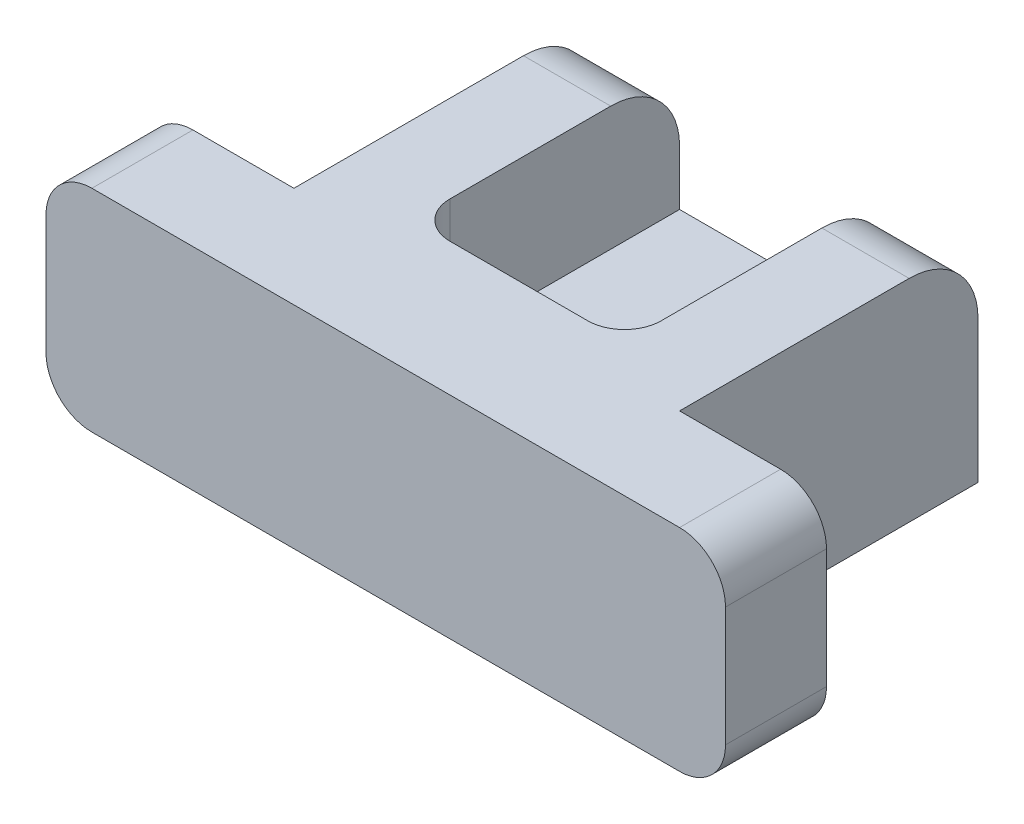
ISO-10303-21;
HEADER;
FILE_DESCRIPTION(('STEP AP214'),'2;1');
FILE_NAME('part.step','',(''),(''),'','','');
FILE_SCHEMA(('AUTOMOTIVE_DESIGN { 1 0 10303 214 1 1 1 1 }'));
ENDSEC;
DATA;
#1=APPLICATION_CONTEXT('core data for automotive mechanical design processes');
#2=APPLICATION_PROTOCOL_DEFINITION('international standard','automotive_design',2000,#1);
#3=PRODUCT_CONTEXT('',#1,'mechanical');
#4=PRODUCT('Part','Part','',(#3));
#5=PRODUCT_RELATED_PRODUCT_CATEGORY('part','',(#4));
#6=PRODUCT_DEFINITION_FORMATION('','',#4);
#7=PRODUCT_DEFINITION_CONTEXT('part definition',#1,'design');
#8=PRODUCT_DEFINITION('design','',#6,#7);
#9=PRODUCT_DEFINITION_SHAPE('','',#8);
#10=(LENGTH_UNIT() NAMED_UNIT(*) SI_UNIT(.MILLI.,.METRE.));
#11=(NAMED_UNIT(*) PLANE_ANGLE_UNIT() SI_UNIT($,.RADIAN.));
#12=(NAMED_UNIT(*) SI_UNIT($,.STERADIAN.) SOLID_ANGLE_UNIT());
#13=UNCERTAINTY_MEASURE_WITH_UNIT(LENGTH_MEASURE(1.E-05),#10,'distance_accuracy_value','');
#14=(GEOMETRIC_REPRESENTATION_CONTEXT(3) GLOBAL_UNCERTAINTY_ASSIGNED_CONTEXT((#13)) GLOBAL_UNIT_ASSIGNED_CONTEXT((#10,
#11,#12)) REPRESENTATION_CONTEXT('',''));
#15=CARTESIAN_POINT('',(0.,0.,0.));
#16=DIRECTION('',(0.,0.,1.));
#17=DIRECTION('',(1.,0.,0.));
#18=AXIS2_PLACEMENT_3D('',#15,#16,#17);
#19=CARTESIAN_POINT('',(640.,360.,0.));
#20=DIRECTION('',(0.,0.,1.));
#21=DIRECTION('',(1.,0.,0.));
#22=AXIS2_PLACEMENT_3D('',#19,#20,#21);
#23=PLANE('',#22);
#24=DIRECTION('',(0.,1.,0.));
#25=VECTOR('',#24,1.);
#26=CARTESIAN_POINT('',(-420.,0.,0.));
#27=LINE('',#26,#25);
#28=CARTESIAN_POINT('',(-420.,0.,0.));
#29=VERTEX_POINT('',#28);
#30=CARTESIAN_POINT('',(-420.,460.,0.));
#31=VERTEX_POINT('',#30);
#32=EDGE_CURVE('E278',#29,#31,#27,.T.);
#33=ORIENTED_EDGE('',*,*,#32,.F.);
#34=DIRECTION('',(1.,0.,0.));
#35=VECTOR('',#34,1.);
#36=CARTESIAN_POINT('',(639.999999999999,0.,0.));
#37=LINE('',#36,#35);
#38=CARTESIAN_POINT('',(-639.999999999999,0.,0.));
#39=VERTEX_POINT('',#38);
#40=EDGE_CURVE('E333',#39,#29,#37,.T.);
#41=ORIENTED_EDGE('',*,*,#40,.F.);
#42=CARTESIAN_POINT('',(-640.,100.,0.));
#43=DIRECTION('',(0.,0.,1.));
#44=DIRECTION('',(1.,0.,0.));
#45=AXIS2_PLACEMENT_3D('',#42,#43,#44);
#46=CIRCLE('',#45,100.);
#47=CARTESIAN_POINT('',(-740.,100.000000000001,0.));
#48=VERTEX_POINT('',#47);
#49=EDGE_CURVE('E329',#48,#39,#46,.T.);
#50=ORIENTED_EDGE('',*,*,#49,.F.);
#51=DIRECTION('',(0.,-1.,0.));
#52=VECTOR('',#51,1.);
#53=CARTESIAN_POINT('',(-740.,359.999999999999,0.));
#54=LINE('',#53,#52);
#55=CARTESIAN_POINT('',(-740.,359.999999999999,0.));
#56=VERTEX_POINT('',#55);
#57=EDGE_CURVE('E326',#56,#48,#54,.T.);
#58=ORIENTED_EDGE('',*,*,#57,.F.);
#59=CARTESIAN_POINT('',(-640.,360.,0.));
#60=DIRECTION('',(0.,0.,1.));
#61=DIRECTION('',(-1.,0.,0.));
#62=AXIS2_PLACEMENT_3D('',#59,#60,#61);
#63=CIRCLE('',#62,100.);
#64=CARTESIAN_POINT('',(-639.999999999999,460.,0.));
#65=VERTEX_POINT('',#64);
#66=EDGE_CURVE('E323',#65,#56,#63,.T.);
#67=ORIENTED_EDGE('',*,*,#66,.F.);
#68=DIRECTION('',(-1.,0.,0.));
#69=VECTOR('',#68,1.);
#70=CARTESIAN_POINT('',(-639.999999999999,460.,0.));
#71=LINE('',#70,#69);
#72=EDGE_CURVE('E318',#31,#65,#71,.T.);
#73=ORIENTED_EDGE('',*,*,#72,.F.);
#74=EDGE_LOOP('',(#33,#41,#50,#58,#67,#73));
#75=FACE_BOUND('',#74,.T.);
#76=ADVANCED_FACE('F45',(#75),#23,.F.);
#77=CARTESIAN_POINT('',(640.,360.,220.));
#78=DIRECTION('',(0.,0.,-1.));
#79=DIRECTION('',(-1.,0.,0.));
#80=AXIS2_PLACEMENT_3D('',#77,#78,#79);
#81=CYLINDRICAL_SURFACE('',#80,100.);
#82=CARTESIAN_POINT('',(640.,360.,0.));
#83=DIRECTION('',(0.,0.,1.));
#84=DIRECTION('',(1.,0.,0.));
#85=AXIS2_PLACEMENT_3D('',#82,#83,#84);
#86=CIRCLE('',#85,100.);
#87=CARTESIAN_POINT('',(740.,359.999999999999,0.));
#88=VERTEX_POINT('',#87);
#89=CARTESIAN_POINT('',(639.999999999999,460.,0.));
#90=VERTEX_POINT('',#89);
#91=EDGE_CURVE('E277',#88,#90,#86,.T.);
#92=ORIENTED_EDGE('',*,*,#91,.T.);
#93=DIRECTION('',(0.,0.,-1.));
#94=VECTOR('',#93,1.);
#95=CARTESIAN_POINT('',(639.999999999999,460.,220.));
#96=LINE('',#95,#94);
#97=CARTESIAN_POINT('',(639.999999999999,460.,220.));
#98=VERTEX_POINT('',#97);
#99=EDGE_CURVE('E369',#98,#90,#96,.T.);
#100=ORIENTED_EDGE('',*,*,#99,.F.);
#101=CARTESIAN_POINT('',(640.,360.,220.));
#102=DIRECTION('',(0.,0.,1.));
#103=DIRECTION('',(1.,0.,0.));
#104=AXIS2_PLACEMENT_3D('',#101,#102,#103);
#105=CIRCLE('',#104,100.);
#106=CARTESIAN_POINT('',(740.,359.999999999999,220.));
#107=VERTEX_POINT('',#106);
#108=EDGE_CURVE('E288',#107,#98,#105,.T.);
#109=ORIENTED_EDGE('',*,*,#108,.F.);
#110=DIRECTION('',(0.,0.,-1.));
#111=VECTOR('',#110,1.);
#112=CARTESIAN_POINT('',(740.,359.999999999999,220.));
#113=LINE('',#112,#111);
#114=EDGE_CURVE('E314',#107,#88,#113,.T.);
#115=ORIENTED_EDGE('',*,*,#114,.T.);
#116=EDGE_LOOP('',(#92,#100,#109,#115));
#117=FACE_BOUND('',#116,.T.);
#118=ADVANCED_FACE('F425',(#117),#81,.T.);
#119=CARTESIAN_POINT('',(-639.999999999999,460.,220.));
#120=DIRECTION('',(0.,-1.,0.));
#121=DIRECTION('',(0.,0.,-1.));
#122=AXIS2_PLACEMENT_3D('',#119,#120,#121);
#123=PLANE('',#122);
#124=DIRECTION('',(0.,0.,-1.));
#125=VECTOR('',#124,1.);
#126=CARTESIAN_POINT('',(420.,460.,-650.));
#127=LINE('',#126,#125);
#128=CARTESIAN_POINT('',(420.,460.,0.));
#129=VERTEX_POINT('',#128);
#130=CARTESIAN_POINT('',(420.,460.,-500.));
#131=VERTEX_POINT('',#130);
#132=EDGE_CURVE('E241',#129,#131,#127,.T.);
#133=ORIENTED_EDGE('',*,*,#132,.T.);
#134=DIRECTION('',(-1.,0.,0.));
#135=VECTOR('',#134,1.);
#136=CARTESIAN_POINT('',(230.,460.,-500.));
#137=LINE('',#136,#135);
#138=CARTESIAN_POINT('',(230.,460.,-500.));
#139=VERTEX_POINT('',#138);
#140=EDGE_CURVE('E386',#131,#139,#137,.T.);
#141=ORIENTED_EDGE('',*,*,#140,.T.);
#142=DIRECTION('',(0.,0.,1.));
#143=VECTOR('',#142,1.);
#144=CARTESIAN_POINT('',(230.,460.,0.));
#145=LINE('',#144,#143);
#146=CARTESIAN_POINT('',(230.,460.,-150.000000000001));
#147=VERTEX_POINT('',#146);
#148=EDGE_CURVE('E229',#139,#147,#145,.T.);
#149=ORIENTED_EDGE('',*,*,#148,.T.);
#150=CARTESIAN_POINT('',(150.,460.,-150.));
#151=DIRECTION('',(0.,1.,0.));
#152=DIRECTION('',(0.,0.,1.));
#153=AXIS2_PLACEMENT_3D('',#150,#151,#152);
#154=CIRCLE('',#153,80.);
#155=CARTESIAN_POINT('',(149.999999999999,460.,-70.));
#156=VERTEX_POINT('',#155);
#157=EDGE_CURVE('E226',#156,#147,#154,.T.);
#158=ORIENTED_EDGE('',*,*,#157,.F.);
#159=DIRECTION('',(-1.,0.,0.));
#160=VECTOR('',#159,1.);
#161=CARTESIAN_POINT('',(0.,460.,-70.));
#162=LINE('',#161,#160);
#163=CARTESIAN_POINT('',(-149.999999999999,460.,-70.));
#164=VERTEX_POINT('',#163);
#165=EDGE_CURVE('E189',#156,#164,#162,.T.);
#166=ORIENTED_EDGE('',*,*,#165,.T.);
#167=CARTESIAN_POINT('',(-150.,460.,-150.));
#168=DIRECTION('',(0.,1.,0.));
#169=DIRECTION('',(0.,0.,1.));
#170=AXIS2_PLACEMENT_3D('',#167,#168,#169);
#171=CIRCLE('',#170,80.);
#172=CARTESIAN_POINT('',(-230.,460.,-150.000000000001));
#173=VERTEX_POINT('',#172);
#174=EDGE_CURVE('E204',#164,#173,#171,.F.);
#175=ORIENTED_EDGE('',*,*,#174,.T.);
#176=DIRECTION('',(0.,0.,1.));
#177=VECTOR('',#176,1.);
#178=CARTESIAN_POINT('',(-230.,460.,0.));
#179=LINE('',#178,#177);
#180=CARTESIAN_POINT('',(-230.,460.,-500.));
#181=VERTEX_POINT('',#180);
#182=EDGE_CURVE('E232',#181,#173,#179,.T.);
#183=ORIENTED_EDGE('',*,*,#182,.F.);
#184=DIRECTION('',(-1.,0.,0.));
#185=VECTOR('',#184,1.);
#186=CARTESIAN_POINT('',(-420.,460.,-500.));
#187=LINE('',#186,#185);
#188=CARTESIAN_POINT('',(-420.,460.,-500.));
#189=VERTEX_POINT('',#188);
#190=EDGE_CURVE('E373',#181,#189,#187,.T.);
#191=ORIENTED_EDGE('',*,*,#190,.T.);
#192=DIRECTION('',(0.,0.,1.));
#193=VECTOR('',#192,1.);
#194=CARTESIAN_POINT('',(-420.,460.,-650.));
#195=LINE('',#194,#193);
#196=EDGE_CURVE('E260',#189,#31,#195,.T.);
#197=ORIENTED_EDGE('',*,*,#196,.T.);
#198=ORIENTED_EDGE('',*,*,#72,.T.);
#199=DIRECTION('',(0.,0.,-1.));
#200=VECTOR('',#199,1.);
#201=CARTESIAN_POINT('',(-639.999999999999,460.,220.));
#202=LINE('',#201,#200);
#203=CARTESIAN_POINT('',(-639.999999999999,460.,220.));
#204=VERTEX_POINT('',#203);
#205=EDGE_CURVE('E365',#204,#65,#202,.T.);
#206=ORIENTED_EDGE('',*,*,#205,.F.);
#207=DIRECTION('',(-1.,0.,0.));
#208=VECTOR('',#207,1.);
#209=CARTESIAN_POINT('',(-639.999999999999,460.,220.));
#210=LINE('',#209,#208);
#211=EDGE_CURVE('E292',#98,#204,#210,.T.);
#212=ORIENTED_EDGE('',*,*,#211,.F.);
#213=ORIENTED_EDGE('',*,*,#99,.T.);
#214=EDGE_CURVE('E319',#90,#129,#71,.T.);
#215=ORIENTED_EDGE('',*,*,#214,.T.);
#216=EDGE_LOOP('',(#133,#141,#149,#158,#166,#175,#183,#191,#197,#198,#206,#212,#213,#215));
#217=FACE_BOUND('',#216,.T.);
#218=ADVANCED_FACE('F397',(#217),#123,.F.);
#219=CARTESIAN_POINT('',(-640.,360.,220.));
#220=DIRECTION('',(0.,0.,-1.));
#221=DIRECTION('',(-1.,0.,0.));
#222=AXIS2_PLACEMENT_3D('',#219,#220,#221);
#223=CYLINDRICAL_SURFACE('',#222,100.);
#224=ORIENTED_EDGE('',*,*,#66,.T.);
#225=DIRECTION('',(0.,0.,-1.));
#226=VECTOR('',#225,1.);
#227=CARTESIAN_POINT('',(-740.,359.999999999999,220.));
#228=LINE('',#227,#226);
#229=CARTESIAN_POINT('',(-740.,359.999999999999,220.));
#230=VERTEX_POINT('',#229);
#231=EDGE_CURVE('E361',#230,#56,#228,.T.);
#232=ORIENTED_EDGE('',*,*,#231,.F.);
#233=CARTESIAN_POINT('',(-640.,360.,220.));
#234=DIRECTION('',(0.,0.,1.));
#235=DIRECTION('',(-1.,0.,0.));
#236=AXIS2_PLACEMENT_3D('',#233,#234,#235);
#237=CIRCLE('',#236,100.);
#238=EDGE_CURVE('E296',#204,#230,#237,.T.);
#239=ORIENTED_EDGE('',*,*,#238,.F.);
#240=ORIENTED_EDGE('',*,*,#205,.T.);
#241=EDGE_LOOP('',(#224,#232,#239,#240));
#242=FACE_BOUND('',#241,.T.);
#243=ADVANCED_FACE('F404',(#242),#223,.T.);
#244=CARTESIAN_POINT('',(-740.,359.999999999999,220.));
#245=DIRECTION('',(1.,0.,0.));
#246=DIRECTION('',(0.,1.,0.));
#247=AXIS2_PLACEMENT_3D('',#244,#245,#246);
#248=PLANE('',#247);
#249=ORIENTED_EDGE('',*,*,#57,.T.);
#250=DIRECTION('',(0.,0.,-1.));
#251=VECTOR('',#250,1.);
#252=CARTESIAN_POINT('',(-740.,100.000000000001,220.));
#253=LINE('',#252,#251);
#254=CARTESIAN_POINT('',(-740.,100.000000000001,220.));
#255=VERTEX_POINT('',#254);
#256=EDGE_CURVE('E357',#255,#48,#253,.T.);
#257=ORIENTED_EDGE('',*,*,#256,.F.);
#258=DIRECTION('',(0.,-1.,0.));
#259=VECTOR('',#258,1.);
#260=CARTESIAN_POINT('',(-740.,359.999999999999,220.));
#261=LINE('',#260,#259);
#262=EDGE_CURVE('E299',#230,#255,#261,.T.);
#263=ORIENTED_EDGE('',*,*,#262,.F.);
#264=ORIENTED_EDGE('',*,*,#231,.T.);
#265=EDGE_LOOP('',(#249,#257,#263,#264));
#266=FACE_BOUND('',#265,.T.);
#267=ADVANCED_FACE('F411',(#266),#248,.F.);
#268=CARTESIAN_POINT('',(-640.,100.,220.));
#269=DIRECTION('',(0.,0.,-1.));
#270=DIRECTION('',(-1.,0.,0.));
#271=AXIS2_PLACEMENT_3D('',#268,#269,#270);
#272=CYLINDRICAL_SURFACE('',#271,100.);
#273=ORIENTED_EDGE('',*,*,#49,.T.);
#274=DIRECTION('',(0.,0.,-1.));
#275=VECTOR('',#274,1.);
#276=CARTESIAN_POINT('',(-639.999999999999,0.,220.));
#277=LINE('',#276,#275);
#278=CARTESIAN_POINT('',(-639.999999999999,0.,220.));
#279=VERTEX_POINT('',#278);
#280=EDGE_CURVE('E353',#279,#39,#277,.T.);
#281=ORIENTED_EDGE('',*,*,#280,.F.);
#282=CARTESIAN_POINT('',(-640.,100.,220.));
#283=DIRECTION('',(0.,0.,1.));
#284=DIRECTION('',(1.,0.,0.));
#285=AXIS2_PLACEMENT_3D('',#282,#283,#284);
#286=CIRCLE('',#285,100.);
#287=EDGE_CURVE('E302',#255,#279,#286,.T.);
#288=ORIENTED_EDGE('',*,*,#287,.F.);
#289=ORIENTED_EDGE('',*,*,#256,.T.);
#290=EDGE_LOOP('',(#273,#281,#288,#289));
#291=FACE_BOUND('',#290,.T.);
#292=ADVANCED_FACE('F415',(#291),#272,.T.);
#293=CARTESIAN_POINT('',(639.999999999999,0.,220.));
#294=DIRECTION('',(0.,1.,0.));
#295=DIRECTION('',(0.,0.,1.));
#296=AXIS2_PLACEMENT_3D('',#293,#294,#295);
#297=PLANE('',#296);
#298=ORIENTED_EDGE('',*,*,#40,.T.);
#299=DIRECTION('',(0.,0.,1.));
#300=VECTOR('',#299,1.);
#301=CARTESIAN_POINT('',(-420.,0.,-650.));
#302=LINE('',#301,#300);
#303=CARTESIAN_POINT('',(-420.,0.,-650.));
#304=VERTEX_POINT('',#303);
#305=EDGE_CURVE('E264',#304,#29,#302,.T.);
#306=ORIENTED_EDGE('',*,*,#305,.F.);
#307=DIRECTION('',(-1.,0.,0.));
#308=VECTOR('',#307,1.);
#309=CARTESIAN_POINT('',(-420.,0.,-650.));
#310=LINE('',#309,#308);
#311=CARTESIAN_POINT('',(420.,0.,-650.));
#312=VERTEX_POINT('',#311);
#313=EDGE_CURVE('E259',#312,#304,#310,.T.);
#314=ORIENTED_EDGE('',*,*,#313,.F.);
#315=DIRECTION('',(0.,0.,-1.));
#316=VECTOR('',#315,1.);
#317=CARTESIAN_POINT('',(420.,0.,-650.));
#318=LINE('',#317,#316);
#319=CARTESIAN_POINT('',(420.,0.,0.));
#320=VERTEX_POINT('',#319);
#321=EDGE_CURVE('E255',#320,#312,#318,.T.);
#322=ORIENTED_EDGE('',*,*,#321,.F.);
#323=CARTESIAN_POINT('',(639.999999999999,0.,0.));
#324=VERTEX_POINT('',#323);
#325=EDGE_CURVE('E332',#320,#324,#37,.T.);
#326=ORIENTED_EDGE('',*,*,#325,.T.);
#327=DIRECTION('',(0.,0.,-1.));
#328=VECTOR('',#327,1.);
#329=CARTESIAN_POINT('',(639.999999999999,0.,220.));
#330=LINE('',#329,#328);
#331=CARTESIAN_POINT('',(639.999999999999,0.,220.));
#332=VERTEX_POINT('',#331);
#333=EDGE_CURVE('E349',#332,#324,#330,.T.);
#334=ORIENTED_EDGE('',*,*,#333,.F.);
#335=DIRECTION('',(1.,0.,0.));
#336=VECTOR('',#335,1.);
#337=CARTESIAN_POINT('',(639.999999999999,0.,220.));
#338=LINE('',#337,#336);
#339=EDGE_CURVE('E305',#279,#332,#338,.T.);
#340=ORIENTED_EDGE('',*,*,#339,.F.);
#341=ORIENTED_EDGE('',*,*,#280,.T.);
#342=EDGE_LOOP('',(#298,#306,#314,#322,#326,#334,#340,#341));
#343=FACE_BOUND('',#342,.T.);
#344=ADVANCED_FACE('F437',(#343),#297,.F.);
#345=CARTESIAN_POINT('',(640.,100.,220.));
#346=DIRECTION('',(0.,0.,-1.));
#347=DIRECTION('',(-1.,0.,0.));
#348=AXIS2_PLACEMENT_3D('',#345,#346,#347);
#349=CYLINDRICAL_SURFACE('',#348,100.);
#350=CARTESIAN_POINT('',(640.,100.,0.));
#351=DIRECTION('',(0.,0.,1.));
#352=DIRECTION('',(-1.,0.,0.));
#353=AXIS2_PLACEMENT_3D('',#350,#351,#352);
#354=CIRCLE('',#353,100.);
#355=CARTESIAN_POINT('',(740.,100.000000000001,0.));
#356=VERTEX_POINT('',#355);
#357=EDGE_CURVE('E337',#324,#356,#354,.T.);
#358=ORIENTED_EDGE('',*,*,#357,.T.);
#359=DIRECTION('',(0.,0.,-1.));
#360=VECTOR('',#359,1.);
#361=CARTESIAN_POINT('',(740.,100.000000000001,220.));
#362=LINE('',#361,#360);
#363=CARTESIAN_POINT('',(740.,100.000000000001,220.));
#364=VERTEX_POINT('',#363);
#365=EDGE_CURVE('E345',#364,#356,#362,.T.);
#366=ORIENTED_EDGE('',*,*,#365,.F.);
#367=CARTESIAN_POINT('',(640.,100.,220.));
#368=DIRECTION('',(0.,0.,1.));
#369=DIRECTION('',(-1.,0.,0.));
#370=AXIS2_PLACEMENT_3D('',#367,#368,#369);
#371=CIRCLE('',#370,100.);
#372=EDGE_CURVE('E308',#332,#364,#371,.T.);
#373=ORIENTED_EDGE('',*,*,#372,.F.);
#374=ORIENTED_EDGE('',*,*,#333,.T.);
#375=EDGE_LOOP('',(#358,#366,#373,#374));
#376=FACE_BOUND('',#375,.T.);
#377=ADVANCED_FACE('F462',(#376),#349,.T.);
#378=CARTESIAN_POINT('',(740.,359.999999999999,220.));
#379=DIRECTION('',(-1.,0.,0.));
#380=DIRECTION('',(0.,-1.,0.));
#381=AXIS2_PLACEMENT_3D('',#378,#379,#380);
#382=PLANE('',#381);
#383=DIRECTION('',(0.,1.,0.));
#384=VECTOR('',#383,1.);
#385=CARTESIAN_POINT('',(740.,359.999999999999,0.));
#386=LINE('',#385,#384);
#387=EDGE_CURVE('E293',#356,#88,#386,.T.);
#388=ORIENTED_EDGE('',*,*,#387,.T.);
#389=ORIENTED_EDGE('',*,*,#114,.F.);
#390=DIRECTION('',(0.,1.,0.));
#391=VECTOR('',#390,1.);
#392=CARTESIAN_POINT('',(740.,359.999999999999,220.));
#393=LINE('',#392,#391);
#394=EDGE_CURVE('E311',#364,#107,#393,.T.);
#395=ORIENTED_EDGE('',*,*,#394,.F.);
#396=ORIENTED_EDGE('',*,*,#365,.T.);
#397=EDGE_LOOP('',(#388,#389,#395,#396));
#398=FACE_BOUND('',#397,.T.);
#399=ADVANCED_FACE('F465',(#398),#382,.F.);
#400=CARTESIAN_POINT('',(640.,360.,220.));
#401=DIRECTION('',(0.,0.,1.));
#402=DIRECTION('',(1.,0.,0.));
#403=AXIS2_PLACEMENT_3D('',#400,#401,#402);
#404=PLANE('',#403);
#405=ORIENTED_EDGE('',*,*,#108,.T.);
#406=ORIENTED_EDGE('',*,*,#211,.T.);
#407=ORIENTED_EDGE('',*,*,#238,.T.);
#408=ORIENTED_EDGE('',*,*,#262,.T.);
#409=ORIENTED_EDGE('',*,*,#287,.T.);
#410=ORIENTED_EDGE('',*,*,#339,.T.);
#411=ORIENTED_EDGE('',*,*,#372,.T.);
#412=ORIENTED_EDGE('',*,*,#394,.T.);
#413=EDGE_LOOP('',(#405,#406,#407,#408,#409,#410,#411,#412));
#414=FACE_BOUND('',#413,.T.);
#415=ADVANCED_FACE('F419',(#414),#404,.T.);
#416=ORIENTED_EDGE('',*,*,#325,.F.);
#417=DIRECTION('',(0.,1.,0.));
#418=VECTOR('',#417,1.);
#419=CARTESIAN_POINT('',(420.,0.,0.));
#420=LINE('',#419,#418);
#421=EDGE_CURVE('E273',#320,#129,#420,.T.);
#422=ORIENTED_EDGE('',*,*,#421,.T.);
#423=ORIENTED_EDGE('',*,*,#214,.F.);
#424=ORIENTED_EDGE('',*,*,#91,.F.);
#425=ORIENTED_EDGE('',*,*,#387,.F.);
#426=ORIENTED_EDGE('',*,*,#357,.F.);
#427=EDGE_LOOP('',(#416,#422,#423,#424,#425,#426));
#428=FACE_BOUND('',#427,.T.);
#429=ADVANCED_FACE('F430',(#428),#23,.F.);
#430=CARTESIAN_POINT('',(420.,0.,-650.));
#431=DIRECTION('',(1.,0.,0.));
#432=DIRECTION('',(0.,0.,-1.));
#433=AXIS2_PLACEMENT_3D('',#430,#431,#432);
#434=PLANE('',#433);
#435=DIRECTION('',(0.,1.,0.));
#436=VECTOR('',#435,1.);
#437=CARTESIAN_POINT('',(420.,0.,-650.));
#438=LINE('',#437,#436);
#439=CARTESIAN_POINT('',(420.,310.,-650.));
#440=VERTEX_POINT('',#439);
#441=EDGE_CURVE('E267',#312,#440,#438,.T.);
#442=ORIENTED_EDGE('',*,*,#441,.T.);
#443=CARTESIAN_POINT('',(420.,310.,-500.));
#444=DIRECTION('',(1.,0.,0.));
#445=DIRECTION('',(0.,0.,-1.));
#446=AXIS2_PLACEMENT_3D('',#443,#444,#445);
#447=CIRCLE('',#446,150.);
#448=EDGE_CURVE('E11',#440,#131,#447,.T.);
#449=ORIENTED_EDGE('',*,*,#448,.T.);
#450=ORIENTED_EDGE('',*,*,#132,.F.);
#451=ORIENTED_EDGE('',*,*,#421,.F.);
#452=ORIENTED_EDGE('',*,*,#321,.T.);
#453=EDGE_LOOP('',(#442,#449,#450,#451,#452));
#454=FACE_BOUND('',#453,.T.);
#455=ADVANCED_FACE('F434',(#454),#434,.T.);
#456=CARTESIAN_POINT('',(-420.,0.,-650.));
#457=DIRECTION('',(-1.,0.,0.));
#458=DIRECTION('',(0.,0.,1.));
#459=AXIS2_PLACEMENT_3D('',#456,#457,#458);
#460=PLANE('',#459);
#461=ORIENTED_EDGE('',*,*,#196,.F.);
#462=CARTESIAN_POINT('',(-420.,310.,-500.));
#463=DIRECTION('',(-1.,0.,0.));
#464=DIRECTION('',(0.,0.,1.));
#465=AXIS2_PLACEMENT_3D('',#462,#463,#464);
#466=CIRCLE('',#465,150.);
#467=CARTESIAN_POINT('',(-420.,310.,-650.));
#468=VERTEX_POINT('',#467);
#469=EDGE_CURVE('E377',#189,#468,#466,.T.);
#470=ORIENTED_EDGE('',*,*,#469,.T.);
#471=DIRECTION('',(0.,1.,0.));
#472=VECTOR('',#471,1.);
#473=CARTESIAN_POINT('',(-420.,0.,-650.));
#474=LINE('',#473,#472);
#475=EDGE_CURVE('E282',#304,#468,#474,.T.);
#476=ORIENTED_EDGE('',*,*,#475,.F.);
#477=ORIENTED_EDGE('',*,*,#305,.T.);
#478=ORIENTED_EDGE('',*,*,#32,.T.);
#479=EDGE_LOOP('',(#461,#470,#476,#477,#478));
#480=FACE_BOUND('',#479,.T.);
#481=ADVANCED_FACE('F458',(#480),#460,.T.);
#482=CARTESIAN_POINT('',(-420.,0.,-650.));
#483=DIRECTION('',(0.,0.,-1.));
#484=DIRECTION('',(-1.,0.,0.));
#485=AXIS2_PLACEMENT_3D('',#482,#483,#484);
#486=PLANE('',#485);
#487=DIRECTION('',(0.,1.,0.));
#488=VECTOR('',#487,1.);
#489=CARTESIAN_POINT('',(230.,190.,-650.));
#490=LINE('',#489,#488);
#491=CARTESIAN_POINT('',(230.,190.,-650.));
#492=VERTEX_POINT('',#491);
#493=CARTESIAN_POINT('',(230.,310.,-650.));
#494=VERTEX_POINT('',#493);
#495=EDGE_CURVE('E250',#492,#494,#490,.T.);
#496=ORIENTED_EDGE('',*,*,#495,.T.);
#497=DIRECTION('',(-1.,0.,0.));
#498=VECTOR('',#497,1.);
#499=CARTESIAN_POINT('',(420.,310.,-650.));
#500=LINE('',#499,#498);
#501=EDGE_CURVE('E54',#494,#440,#500,.F.);
#502=ORIENTED_EDGE('',*,*,#501,.T.);
#503=ORIENTED_EDGE('',*,*,#441,.F.);
#504=ORIENTED_EDGE('',*,*,#313,.T.);
#505=ORIENTED_EDGE('',*,*,#475,.T.);
#506=DIRECTION('',(-1.,0.,0.));
#507=VECTOR('',#506,1.);
#508=CARTESIAN_POINT('',(-230.,310.,-650.));
#509=LINE('',#508,#507);
#510=CARTESIAN_POINT('',(-230.,310.,-650.));
#511=VERTEX_POINT('',#510);
#512=EDGE_CURVE('E380',#468,#511,#509,.F.);
#513=ORIENTED_EDGE('',*,*,#512,.T.);
#514=DIRECTION('',(0.,1.,0.));
#515=VECTOR('',#514,1.);
#516=CARTESIAN_POINT('',(-230.,190.,-650.));
#517=LINE('',#516,#515);
#518=CARTESIAN_POINT('',(-230.,190.,-650.));
#519=VERTEX_POINT('',#518);
#520=EDGE_CURVE('E246',#519,#511,#517,.T.);
#521=ORIENTED_EDGE('',*,*,#520,.F.);
#522=DIRECTION('',(-1.,0.,0.));
#523=VECTOR('',#522,1.);
#524=CARTESIAN_POINT('',(0.,190.,-650.));
#525=LINE('',#524,#523);
#526=EDGE_CURVE('E213',#492,#519,#525,.T.);
#527=ORIENTED_EDGE('',*,*,#526,.F.);
#528=EDGE_LOOP('',(#496,#502,#503,#504,#505,#513,#521,#527));
#529=FACE_BOUND('',#528,.T.);
#530=ADVANCED_FACE('F439',(#529),#486,.T.);
#531=CARTESIAN_POINT('',(0.,190.,-70.));
#532=DIRECTION('',(0.,0.,-1.));
#533=DIRECTION('',(-1.,0.,0.));
#534=AXIS2_PLACEMENT_3D('',#531,#532,#533);
#535=PLANE('',#534);
#536=ORIENTED_EDGE('',*,*,#165,.F.);
#537=DIRECTION('',(0.,1.,0.));
#538=VECTOR('',#537,1.);
#539=CARTESIAN_POINT('',(149.999999999999,190.,-70.));
#540=LINE('',#539,#538);
#541=CARTESIAN_POINT('',(149.999999999999,190.,-70.));
#542=VERTEX_POINT('',#541);
#543=EDGE_CURVE('E182',#542,#156,#540,.T.);
#544=ORIENTED_EDGE('',*,*,#543,.F.);
#545=DIRECTION('',(-1.,0.,0.));
#546=VECTOR('',#545,1.);
#547=CARTESIAN_POINT('',(0.,190.,-70.));
#548=LINE('',#547,#546);
#549=CARTESIAN_POINT('',(-149.999999999999,190.,-70.));
#550=VERTEX_POINT('',#549);
#551=EDGE_CURVE('E186',#542,#550,#548,.T.);
#552=ORIENTED_EDGE('',*,*,#551,.T.);
#553=DIRECTION('',(0.,1.,0.));
#554=VECTOR('',#553,1.);
#555=CARTESIAN_POINT('',(-149.999999999999,190.,-70.));
#556=LINE('',#555,#554);
#557=EDGE_CURVE('E238',#550,#164,#556,.T.);
#558=ORIENTED_EDGE('',*,*,#557,.T.);
#559=EDGE_LOOP('',(#536,#544,#552,#558));
#560=FACE_BOUND('',#559,.T.);
#561=ADVANCED_FACE('F184',(#560),#535,.T.);
#562=CARTESIAN_POINT('',(-150.,190.,-150.));
#563=DIRECTION('',(0.,1.,0.));
#564=DIRECTION('',(0.,0.,1.));
#565=AXIS2_PLACEMENT_3D('',#562,#563,#564);
#566=CYLINDRICAL_SURFACE('',#565,80.);
#567=ORIENTED_EDGE('',*,*,#174,.F.);
#568=ORIENTED_EDGE('',*,*,#557,.F.);
#569=CARTESIAN_POINT('',(-150.,190.,-150.));
#570=DIRECTION('',(0.,1.,0.));
#571=DIRECTION('',(0.,0.,1.));
#572=AXIS2_PLACEMENT_3D('',#569,#570,#571);
#573=CIRCLE('',#572,80.);
#574=CARTESIAN_POINT('',(-230.,190.,-150.000000000001));
#575=VERTEX_POINT('',#574);
#576=EDGE_CURVE('E196',#550,#575,#573,.F.);
#577=ORIENTED_EDGE('',*,*,#576,.T.);
#578=DIRECTION('',(0.,1.,0.));
#579=VECTOR('',#578,1.);
#580=CARTESIAN_POINT('',(-230.,190.,-150.000000000001));
#581=LINE('',#580,#579);
#582=EDGE_CURVE('E242',#575,#173,#581,.T.);
#583=ORIENTED_EDGE('',*,*,#582,.T.);
#584=EDGE_LOOP('',(#567,#568,#577,#583));
#585=FACE_BOUND('',#584,.T.);
#586=ADVANCED_FACE('F448',(#585),#566,.F.);
#587=CARTESIAN_POINT('',(-230.,190.,0.));
#588=DIRECTION('',(-1.,0.,0.));
#589=DIRECTION('',(0.,0.,1.));
#590=AXIS2_PLACEMENT_3D('',#587,#588,#589);
#591=PLANE('',#590);
#592=ORIENTED_EDGE('',*,*,#520,.T.);
#593=CARTESIAN_POINT('',(-230.,310.,-500.));
#594=DIRECTION('',(-1.,0.,0.));
#595=DIRECTION('',(0.,0.,1.));
#596=AXIS2_PLACEMENT_3D('',#593,#594,#595);
#597=CIRCLE('',#596,150.);
#598=EDGE_CURVE('E383',#511,#181,#597,.F.);
#599=ORIENTED_EDGE('',*,*,#598,.T.);
#600=ORIENTED_EDGE('',*,*,#182,.T.);
#601=ORIENTED_EDGE('',*,*,#582,.F.);
#602=DIRECTION('',(0.,0.,1.));
#603=VECTOR('',#602,1.);
#604=CARTESIAN_POINT('',(-230.,190.,0.));
#605=LINE('',#604,#603);
#606=EDGE_CURVE('E219',#519,#575,#605,.T.);
#607=ORIENTED_EDGE('',*,*,#606,.F.);
#608=EDGE_LOOP('',(#592,#599,#600,#601,#607));
#609=FACE_BOUND('',#608,.T.);
#610=ADVANCED_FACE('F451',(#609),#591,.F.);
#611=CARTESIAN_POINT('',(230.,190.,0.));
#612=DIRECTION('',(-1.,0.,0.));
#613=DIRECTION('',(0.,0.,1.));
#614=AXIS2_PLACEMENT_3D('',#611,#612,#613);
#615=PLANE('',#614);
#616=ORIENTED_EDGE('',*,*,#148,.F.);
#617=CARTESIAN_POINT('',(230.,310.,-500.));
#618=DIRECTION('',(-1.,0.,0.));
#619=DIRECTION('',(0.,0.,1.));
#620=AXIS2_PLACEMENT_3D('',#617,#618,#619);
#621=CIRCLE('',#620,150.);
#622=EDGE_CURVE('E68',#139,#494,#621,.T.);
#623=ORIENTED_EDGE('',*,*,#622,.T.);
#624=ORIENTED_EDGE('',*,*,#495,.F.);
#625=DIRECTION('',(0.,0.,1.));
#626=VECTOR('',#625,1.);
#627=CARTESIAN_POINT('',(230.,190.,0.));
#628=LINE('',#627,#626);
#629=CARTESIAN_POINT('',(230.,190.,-150.000000000001));
#630=VERTEX_POINT('',#629);
#631=EDGE_CURVE('E210',#492,#630,#628,.T.);
#632=ORIENTED_EDGE('',*,*,#631,.T.);
#633=DIRECTION('',(0.,1.,0.));
#634=VECTOR('',#633,1.);
#635=CARTESIAN_POINT('',(230.,190.,-150.000000000001));
#636=LINE('',#635,#634);
#637=EDGE_CURVE('E195',#630,#147,#636,.T.);
#638=ORIENTED_EDGE('',*,*,#637,.T.);
#639=EDGE_LOOP('',(#616,#623,#624,#632,#638));
#640=FACE_BOUND('',#639,.T.);
#641=ADVANCED_FACE('F444',(#640),#615,.T.);
#642=CARTESIAN_POINT('',(150.,190.,-150.));
#643=DIRECTION('',(0.,1.,0.));
#644=DIRECTION('',(0.,0.,1.));
#645=AXIS2_PLACEMENT_3D('',#642,#643,#644);
#646=CYLINDRICAL_SURFACE('',#645,80.);
#647=ORIENTED_EDGE('',*,*,#157,.T.);
#648=ORIENTED_EDGE('',*,*,#637,.F.);
#649=CARTESIAN_POINT('',(150.,190.,-150.));
#650=DIRECTION('',(0.,1.,0.));
#651=DIRECTION('',(0.,0.,1.));
#652=AXIS2_PLACEMENT_3D('',#649,#650,#651);
#653=CIRCLE('',#652,80.);
#654=EDGE_CURVE('E201',#542,#630,#653,.T.);
#655=ORIENTED_EDGE('',*,*,#654,.F.);
#656=ORIENTED_EDGE('',*,*,#543,.T.);
#657=EDGE_LOOP('',(#647,#648,#655,#656));
#658=FACE_BOUND('',#657,.T.);
#659=ADVANCED_FACE('F207',(#658),#646,.F.);
#660=CARTESIAN_POINT('',(0.,190.,0.));
#661=DIRECTION('',(0.,1.,0.));
#662=DIRECTION('',(0.,0.,1.));
#663=AXIS2_PLACEMENT_3D('',#660,#661,#662);
#664=PLANE('',#663);
#665=ORIENTED_EDGE('',*,*,#551,.F.);
#666=ORIENTED_EDGE('',*,*,#654,.T.);
#667=ORIENTED_EDGE('',*,*,#631,.F.);
#668=ORIENTED_EDGE('',*,*,#526,.T.);
#669=ORIENTED_EDGE('',*,*,#606,.T.);
#670=ORIENTED_EDGE('',*,*,#576,.F.);
#671=EDGE_LOOP('',(#665,#666,#667,#668,#669,#670));
#672=FACE_BOUND('',#671,.T.);
#673=ADVANCED_FACE('F200',(#672),#664,.T.);
#674=CARTESIAN_POINT('',(-639.999999999999,310.,-500.));
#675=DIRECTION('',(1.,0.,0.));
#676=DIRECTION('',(0.,0.,-1.));
#677=AXIS2_PLACEMENT_3D('',#674,#675,#676);
#678=CYLINDRICAL_SURFACE('',#677,150.);
#679=ORIENTED_EDGE('',*,*,#598,.F.);
#680=ORIENTED_EDGE('',*,*,#512,.F.);
#681=ORIENTED_EDGE('',*,*,#469,.F.);
#682=ORIENTED_EDGE('',*,*,#190,.F.);
#683=EDGE_LOOP('',(#679,#680,#681,#682));
#684=FACE_BOUND('',#683,.T.);
#685=ADVANCED_FACE('F456',(#684),#678,.T.);
#686=CARTESIAN_POINT('',(-639.999999999999,310.,-500.));
#687=DIRECTION('',(1.,0.,0.));
#688=DIRECTION('',(0.,0.,-1.));
#689=AXIS2_PLACEMENT_3D('',#686,#687,#688);
#690=CYLINDRICAL_SURFACE('',#689,150.);
#691=ORIENTED_EDGE('',*,*,#448,.F.);
#692=ORIENTED_EDGE('',*,*,#501,.F.);
#693=ORIENTED_EDGE('',*,*,#622,.F.);
#694=ORIENTED_EDGE('',*,*,#140,.F.);
#695=EDGE_LOOP('',(#691,#692,#693,#694));
#696=FACE_BOUND('',#695,.T.);
#697=ADVANCED_FACE('F47',(#696),#690,.T.);
#698=CLOSED_SHELL('',(#76,#118,#218,#243,#267,#292,#344,#377,#399,#415,#429,#455,#481,#530,#561,
#586,#610,#641,#659,#673,#685,#697));
#699=MANIFOLD_SOLID_BREP('B2',#698);
#700=ADVANCED_BREP_SHAPE_REPRESENTATION('',(#18,#699),#14);
#701=SHAPE_DEFINITION_REPRESENTATION(#9,#700);
ENDSEC;
END-ISO-10303-21;
